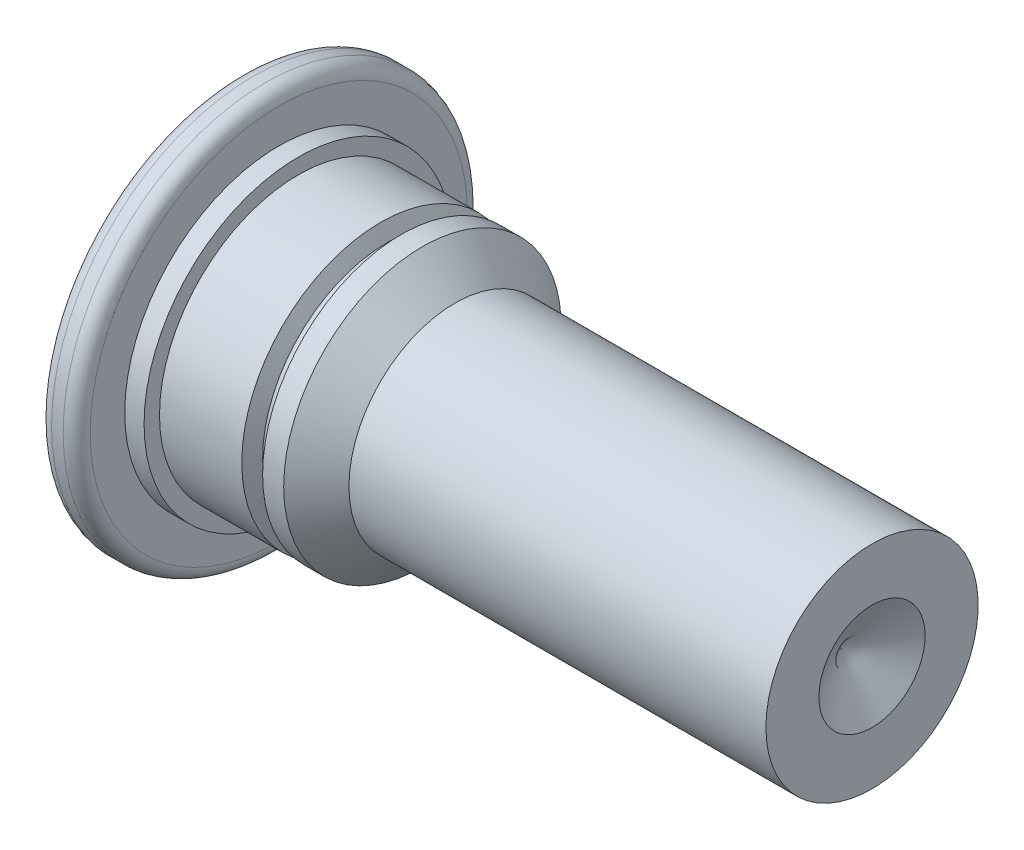
ISO-10303-21;
HEADER;
FILE_DESCRIPTION(('STEP AP214'),'2;1');
FILE_NAME('part.step','',(''),(''),'','','');
FILE_SCHEMA(('AUTOMOTIVE_DESIGN { 1 0 10303 214 1 1 1 1 }'));
ENDSEC;
DATA;
#1=APPLICATION_CONTEXT('core data for automotive mechanical design processes');
#2=APPLICATION_PROTOCOL_DEFINITION('international standard','automotive_design',2000,#1);
#3=PRODUCT_CONTEXT('',#1,'mechanical');
#4=PRODUCT('Part','Part','',(#3));
#5=PRODUCT_RELATED_PRODUCT_CATEGORY('part','',(#4));
#6=PRODUCT_DEFINITION_FORMATION('','',#4);
#7=PRODUCT_DEFINITION_CONTEXT('part definition',#1,'design');
#8=PRODUCT_DEFINITION('design','',#6,#7);
#9=PRODUCT_DEFINITION_SHAPE('','',#8);
#10=(LENGTH_UNIT() NAMED_UNIT(*) SI_UNIT(.MILLI.,.METRE.));
#11=(NAMED_UNIT(*) PLANE_ANGLE_UNIT() SI_UNIT($,.RADIAN.));
#12=(NAMED_UNIT(*) SI_UNIT($,.STERADIAN.) SOLID_ANGLE_UNIT());
#13=UNCERTAINTY_MEASURE_WITH_UNIT(LENGTH_MEASURE(1.E-05),#10,'distance_accuracy_value','');
#14=(GEOMETRIC_REPRESENTATION_CONTEXT(3) GLOBAL_UNCERTAINTY_ASSIGNED_CONTEXT((#13)) GLOBAL_UNIT_ASSIGNED_CONTEXT((#10,
#11,#12)) REPRESENTATION_CONTEXT('',''));
#15=CARTESIAN_POINT('',(0.,0.,0.));
#16=DIRECTION('',(0.,0.,1.));
#17=DIRECTION('',(1.,0.,0.));
#18=AXIS2_PLACEMENT_3D('',#15,#16,#17);
#19=CARTESIAN_POINT('',(0.,0.,0.9479915));
#20=DIRECTION('',(-1.,0.,0.));
#21=DIRECTION('',(0.,0.,1.));
#22=AXIS2_PLACEMENT_3D('',#19,#20,#21);
#23=PLANE('',#22);
#24=CARTESIAN_POINT('',(0.,0.,0.));
#25=DIRECTION('',(1.,0.,0.));
#26=DIRECTION('',(0.,0.,-1.));
#27=AXIS2_PLACEMENT_3D('',#24,#25,#26);
#28=CIRCLE('',#27,1.895983);
#29=CARTESIAN_POINT('',(0.,0.,-1.895983));
#30=VERTEX_POINT('',#29);
#31=CARTESIAN_POINT('',(0.,0.,1.895983));
#32=VERTEX_POINT('',#31);
#33=EDGE_CURVE('E44',#30,#32,#28,.T.);
#34=ORIENTED_EDGE('',*,*,#33,.F.);
#35=CARTESIAN_POINT('',(0.,0.,0.));
#36=DIRECTION('',(1.,0.,0.));
#37=DIRECTION('',(0.,0.,1.));
#38=AXIS2_PLACEMENT_3D('',#35,#36,#37);
#39=CIRCLE('',#38,1.895983);
#40=EDGE_CURVE('E48',#32,#30,#39,.T.);
#41=ORIENTED_EDGE('',*,*,#40,.F.);
#42=EDGE_LOOP('',(#34,#41));
#43=FACE_BOUND('',#42,.T.);
#44=ADVANCED_FACE('F17',(#43),#23,.T.);
#45=CARTESIAN_POINT('',(0.136017,0.,0.));
#46=DIRECTION('',(-1.,0.,0.));
#47=DIRECTION('',(0.,0.,1.));
#48=AXIS2_PLACEMENT_3D('',#45,#46,#47);
#49=TOROIDAL_SURFACE('',#48,1.895983,0.136017);
#50=ORIENTED_EDGE('',*,*,#33,.T.);
#51=ORIENTED_EDGE('',*,*,#40,.T.);
#52=EDGE_LOOP('',(#50,#51));
#53=FACE_BOUND('',#52,.T.);
#54=CARTESIAN_POINT('',(0.136017,0.,0.));
#55=DIRECTION('',(-1.,0.,0.));
#56=DIRECTION('',(0.,0.,1.));
#57=AXIS2_PLACEMENT_3D('',#54,#55,#56);
#58=CIRCLE('',#57,2.032);
#59=CARTESIAN_POINT('',(0.136017,0.,2.032));
#60=VERTEX_POINT('',#59);
#61=EDGE_CURVE('E55',#60,#60,#58,.F.);
#62=ORIENTED_EDGE('',*,*,#61,.F.);
#63=EDGE_LOOP('',(#62));
#64=FACE_BOUND('',#63,.T.);
#65=ADVANCED_FACE('F53',(#53,#64),#49,.T.);
#66=CARTESIAN_POINT('',(0.19431,0.,0.));
#67=DIRECTION('',(-1.,0.,0.));
#68=DIRECTION('',(0.,0.,1.));
#69=AXIS2_PLACEMENT_3D('',#66,#67,#68);
#70=CYLINDRICAL_SURFACE('',#69,2.032);
#71=ORIENTED_EDGE('',*,*,#61,.T.);
#72=EDGE_LOOP('',(#71));
#73=FACE_BOUND('',#72,.T.);
#74=CARTESIAN_POINT('',(0.252603,0.,0.));
#75=DIRECTION('',(-1.,0.,0.));
#76=DIRECTION('',(0.,0.,1.));
#77=AXIS2_PLACEMENT_3D('',#74,#75,#76);
#78=CIRCLE('',#77,2.032);
#79=CARTESIAN_POINT('',(0.252603,0.,2.032));
#80=VERTEX_POINT('',#79);
#81=EDGE_CURVE('E79',#80,#80,#78,.F.);
#82=ORIENTED_EDGE('',*,*,#81,.F.);
#83=EDGE_LOOP('',(#82));
#84=FACE_BOUND('',#83,.T.);
#85=ADVANCED_FACE('F72',(#73,#84),#70,.T.);
#86=CARTESIAN_POINT('',(0.252603,0.,0.));
#87=DIRECTION('',(-1.,0.,0.));
#88=DIRECTION('',(0.,0.,1.));
#89=AXIS2_PLACEMENT_3D('',#86,#87,#88);
#90=TOROIDAL_SURFACE('',#89,1.895983,0.136017);
#91=ORIENTED_EDGE('',*,*,#81,.T.);
#92=EDGE_LOOP('',(#91));
#93=FACE_BOUND('',#92,.T.);
#94=CARTESIAN_POINT('',(0.38862,0.,0.));
#95=DIRECTION('',(-1.,0.,0.));
#96=DIRECTION('',(0.,0.,-1.));
#97=AXIS2_PLACEMENT_3D('',#94,#95,#96);
#98=CIRCLE('',#97,1.895983);
#99=CARTESIAN_POINT('',(0.38862,0.,1.895983));
#100=VERTEX_POINT('',#99);
#101=CARTESIAN_POINT('',(0.38862,0.,-1.895983));
#102=VERTEX_POINT('',#101);
#103=EDGE_CURVE('E115',#100,#102,#98,.F.);
#104=ORIENTED_EDGE('',*,*,#103,.F.);
#105=CARTESIAN_POINT('',(0.38862,0.,0.));
#106=DIRECTION('',(-1.,0.,0.));
#107=DIRECTION('',(0.,0.,1.));
#108=AXIS2_PLACEMENT_3D('',#105,#106,#107);
#109=CIRCLE('',#108,1.895983);
#110=EDGE_CURVE('E82',#102,#100,#109,.F.);
#111=ORIENTED_EDGE('',*,*,#110,.F.);
#112=EDGE_LOOP('',(#104,#111));
#113=FACE_BOUND('',#112,.T.);
#114=ADVANCED_FACE('F87',(#93,#113),#90,.T.);
#115=CARTESIAN_POINT('',(0.38862,0.,1.7226915));
#116=DIRECTION('',(1.,0.,0.));
#117=DIRECTION('',(0.,0.,-1.));
#118=AXIS2_PLACEMENT_3D('',#115,#116,#117);
#119=PLANE('',#118);
#120=CARTESIAN_POINT('',(0.38862,0.,0.));
#121=DIRECTION('',(-1.,0.,0.));
#122=DIRECTION('',(0.,0.,1.));
#123=AXIS2_PLACEMENT_3D('',#120,#121,#122);
#124=CIRCLE('',#123,1.5494);
#125=CARTESIAN_POINT('',(0.38862,0.,1.5494));
#126=VERTEX_POINT('',#125);
#127=EDGE_CURVE('E208',#126,#126,#124,.F.);
#128=ORIENTED_EDGE('',*,*,#127,.F.);
#129=EDGE_LOOP('',(#128));
#130=FACE_BOUND('',#129,.T.);
#131=ORIENTED_EDGE('',*,*,#110,.T.);
#132=ORIENTED_EDGE('',*,*,#103,.T.);
#133=EDGE_LOOP('',(#131,#132));
#134=FACE_BOUND('',#133,.T.);
#135=ADVANCED_FACE('F96',(#130,#134),#119,.T.);
#136=CARTESIAN_POINT('',(0.485775,0.,0.));
#137=DIRECTION('',(-1.,0.,0.));
#138=DIRECTION('',(0.,0.,1.));
#139=AXIS2_PLACEMENT_3D('',#136,#137,#138);
#140=CYLINDRICAL_SURFACE('',#139,1.5494);
#141=ORIENTED_EDGE('',*,*,#127,.T.);
#142=EDGE_LOOP('',(#141));
#143=FACE_BOUND('',#142,.T.);
#144=CARTESIAN_POINT('',(0.58293,0.,0.));
#145=DIRECTION('',(-1.,0.,0.));
#146=DIRECTION('',(0.,0.,1.));
#147=AXIS2_PLACEMENT_3D('',#144,#145,#146);
#148=CIRCLE('',#147,1.5494);
#149=CARTESIAN_POINT('',(0.58293,0.,1.5494));
#150=VERTEX_POINT('',#149);
#151=EDGE_CURVE('E205',#150,#150,#148,.F.);
#152=ORIENTED_EDGE('',*,*,#151,.F.);
#153=EDGE_LOOP('',(#152));
#154=FACE_BOUND('',#153,.T.);
#155=ADVANCED_FACE('F160',(#143,#154),#140,.T.);
#156=CARTESIAN_POINT('',(0.58293,0.,1.47193));
#157=DIRECTION('',(1.,0.,0.));
#158=DIRECTION('',(0.,0.,-1.));
#159=AXIS2_PLACEMENT_3D('',#156,#157,#158);
#160=PLANE('',#159);
#161=CARTESIAN_POINT('',(0.58293,0.,0.));
#162=DIRECTION('',(-1.,0.,0.));
#163=DIRECTION('',(0.,0.,1.));
#164=AXIS2_PLACEMENT_3D('',#161,#162,#163);
#165=CIRCLE('',#164,1.39446);
#166=CARTESIAN_POINT('',(0.58293,0.,1.39446));
#167=VERTEX_POINT('',#166);
#168=EDGE_CURVE('E129',#167,#167,#165,.F.);
#169=ORIENTED_EDGE('',*,*,#168,.F.);
#170=EDGE_LOOP('',(#169));
#171=FACE_BOUND('',#170,.T.);
#172=ORIENTED_EDGE('',*,*,#151,.T.);
#173=EDGE_LOOP('',(#172));
#174=FACE_BOUND('',#173,.T.);
#175=ADVANCED_FACE('F157',(#171,#174),#160,.T.);
#176=CARTESIAN_POINT('',(1.207135,0.,0.));
#177=DIRECTION('',(-1.,0.,0.));
#178=DIRECTION('',(0.,0.,1.));
#179=AXIS2_PLACEMENT_3D('',#176,#177,#178);
#180=CYLINDRICAL_SURFACE('',#179,1.39446);
#181=ORIENTED_EDGE('',*,*,#168,.T.);
#182=EDGE_LOOP('',(#181));
#183=FACE_BOUND('',#182,.T.);
#184=CARTESIAN_POINT('',(1.41008100092677,0.,0.));
#185=DIRECTION('',(-1.,0.,0.));
#186=DIRECTION('',(0.,0.,-1.));
#187=AXIS2_PLACEMENT_3D('',#184,#185,#186);
#188=CIRCLE('',#187,1.39446000048338);
#189=CARTESIAN_POINT('',(1.41008100092677,0.,-1.39446000048338));
#190=VERTEX_POINT('',#189);
#191=EDGE_CURVE('E125',#190,#190,#188,.F.);
#192=ORIENTED_EDGE('',*,*,#191,.F.);
#193=EDGE_LOOP('',(#192));
#194=FACE_BOUND('',#193,.T.);
#195=ADVANCED_FACE('F153',(#183,#194),#180,.T.);
#196=CARTESIAN_POINT('',(1.41008100095519,0.,0.));
#197=DIRECTION('',(-1.,0.,0.));
#198=DIRECTION('',(0.,0.,1.));
#199=AXIS2_PLACEMENT_3D('',#196,#197,#198);
#200=CONICAL_SURFACE('',#199,1.39446000042653,1.10714871779409);
#201=CARTESIAN_POINT('',(1.47980400127,0.,0.));
#202=DIRECTION('',(-1.,0.,0.));
#203=DIRECTION('',(0.,0.,1.));
#204=AXIS2_PLACEMENT_3D('',#201,#202,#203);
#205=CIRCLE('',#204,1.2550140021997);
#206=CARTESIAN_POINT('',(1.47980400127,0.,1.2550140021997));
#207=VERTEX_POINT('',#206);
#208=EDGE_CURVE('E128',#207,#207,#205,.T.);
#209=ORIENTED_EDGE('',*,*,#208,.T.);
#210=EDGE_LOOP('',(#209));
#211=FACE_BOUND('',#210,.T.);
#212=ORIENTED_EDGE('',*,*,#191,.T.);
#213=EDGE_LOOP('',(#212));
#214=FACE_BOUND('',#213,.T.);
#215=ADVANCED_FACE('F148',(#211,#214),#200,.T.);
#216=CARTESIAN_POINT('',(1.5146655,0.,0.));
#217=DIRECTION('',(-1.,0.,0.));
#218=DIRECTION('',(0.,0.,1.));
#219=AXIS2_PLACEMENT_3D('',#216,#217,#218);
#220=TOROIDAL_SURFACE('',#219,1.315395892161,0.0697229999999994);
#221=ORIENTED_EDGE('',*,*,#208,.F.);
#222=EDGE_LOOP('',(#221));
#223=FACE_BOUND('',#222,.T.);
#224=CARTESIAN_POINT('',(1.54952700000877,0.,0.));
#225=DIRECTION('',(1.,0.,0.));
#226=DIRECTION('',(0.,0.,-1.));
#227=AXIS2_PLACEMENT_3D('',#224,#225,#226);
#228=CIRCLE('',#227,1.25501399998029);
#229=CARTESIAN_POINT('',(1.54952700000877,0.,-1.25501399998029));
#230=VERTEX_POINT('',#229);
#231=EDGE_CURVE('E132',#230,#230,#228,.T.);
#232=ORIENTED_EDGE('',*,*,#231,.F.);
#233=EDGE_LOOP('',(#232));
#234=FACE_BOUND('',#233,.T.);
#235=ADVANCED_FACE('F143',(#223,#234),#220,.F.);
#236=CARTESIAN_POINT('',(1.61924999997609,0.,0.));
#237=DIRECTION('',(1.,0.,0.));
#238=DIRECTION('',(0.,1.,0.));
#239=AXIS2_PLACEMENT_3D('',#236,#237,#238);
#240=CONICAL_SURFACE('',#239,1.39445999991494,1.10714871779409);
#241=CARTESIAN_POINT('',(1.61925,0.,0.));
#242=DIRECTION('',(-1.,0.,0.));
#243=DIRECTION('',(0.,0.,1.));
#244=AXIS2_PLACEMENT_3D('',#241,#242,#243);
#245=CIRCLE('',#244,1.39446);
#246=CARTESIAN_POINT('',(1.61925,0.,1.39446));
#247=VERTEX_POINT('',#246);
#248=EDGE_CURVE('E135',#247,#247,#245,.F.);
#249=ORIENTED_EDGE('',*,*,#248,.F.);
#250=EDGE_LOOP('',(#249));
#251=FACE_BOUND('',#250,.T.);
#252=ORIENTED_EDGE('',*,*,#231,.T.);
#253=EDGE_LOOP('',(#252));
#254=FACE_BOUND('',#253,.T.);
#255=ADVANCED_FACE('F147',(#251,#254),#240,.T.);
#256=CARTESIAN_POINT('',(6.34999999999764,0.,0.));
#257=DIRECTION('',(1.,0.,0.));
#258=DIRECTION('',(0.,0.,-1.));
#259=AXIS2_PLACEMENT_3D('',#256,#257,#258);
#260=CONICAL_SURFACE('',#259,0.533400000051643,1.04719755064391);
#261=CARTESIAN_POINT('',(6.04204136635644,0.,8.5265128291212E-11));
#262=VERTEX_POINT('',#261);
#263=VERTEX_LOOP('',#262);
#264=FACE_BOUND('',#263,.T.);
#265=CARTESIAN_POINT('',(6.35000000006327,0.,0.));
#266=DIRECTION('',(1.,0.,0.));
#267=DIRECTION('',(0.,0.,-1.));
#268=AXIS2_PLACEMENT_3D('',#265,#266,#267);
#269=CIRCLE('',#268,0.533400000165329);
#270=CARTESIAN_POINT('',(6.35000000006327,0.,-0.533400000165329));
#271=VERTEX_POINT('',#270);
#272=EDGE_CURVE('E138',#271,#271,#269,.F.);
#273=ORIENTED_EDGE('',*,*,#272,.F.);
#274=EDGE_LOOP('',(#273));
#275=FACE_BOUND('',#274,.T.);
#276=ADVANCED_FACE('F190',(#264,#275),#260,.F.);
#277=CARTESIAN_POINT('',(1.207135,0.,0.));
#278=DIRECTION('',(-1.,0.,0.));
#279=DIRECTION('',(0.,0.,1.));
#280=AXIS2_PLACEMENT_3D('',#277,#278,#279);
#281=CYLINDRICAL_SURFACE('',#280,1.39446);
#282=ORIENTED_EDGE('',*,*,#248,.T.);
#283=EDGE_LOOP('',(#282));
#284=FACE_BOUND('',#283,.T.);
#285=CARTESIAN_POINT('',(1.83133999996699,0.,0.));
#286=DIRECTION('',(-1.,0.,0.));
#287=DIRECTION('',(0.,0.,1.));
#288=AXIS2_PLACEMENT_3D('',#285,#286,#287);
#289=CIRCLE('',#288,1.39446000002863);
#290=CARTESIAN_POINT('',(1.83133999996699,0.,1.39446000002863));
#291=VERTEX_POINT('',#290);
#292=EDGE_CURVE('E141',#291,#291,#289,.F.);
#293=ORIENTED_EDGE('',*,*,#292,.F.);
#294=EDGE_LOOP('',(#293));
#295=FACE_BOUND('',#294,.T.);
#296=ADVANCED_FACE('F187',(#284,#295),#281,.T.);
#297=CARTESIAN_POINT('',(6.35,0.,0.5334));
#298=DIRECTION('',(1.,0.,0.));
#299=DIRECTION('',(0.,0.,-1.));
#300=AXIS2_PLACEMENT_3D('',#297,#298,#299);
#301=PLANE('',#300);
#302=CARTESIAN_POINT('',(6.35,0.,0.));
#303=DIRECTION('',(-1.,0.,0.));
#304=DIRECTION('',(0.,0.,1.));
#305=AXIS2_PLACEMENT_3D('',#302,#303,#304);
#306=CIRCLE('',#305,1.0668);
#307=CARTESIAN_POINT('',(6.35,0.,1.0668));
#308=VERTEX_POINT('',#307);
#309=EDGE_CURVE('E28',#308,#308,#306,.T.);
#310=ORIENTED_EDGE('',*,*,#309,.F.);
#311=EDGE_LOOP('',(#310));
#312=FACE_BOUND('',#311,.T.);
#313=ORIENTED_EDGE('',*,*,#272,.T.);
#314=EDGE_LOOP('',(#313));
#315=FACE_BOUND('',#314,.T.);
#316=ADVANCED_FACE('F179',(#312,#315),#301,.T.);
#317=CARTESIAN_POINT('',(1.83133999991014,0.,0.));
#318=DIRECTION('',(-1.,0.,0.));
#319=DIRECTION('',(0.,0.,1.));
#320=AXIS2_PLACEMENT_3D('',#317,#318,#319);
#321=CONICAL_SURFACE('',#320,1.39446000008547,0.785398163397449);
#322=ORIENTED_EDGE('',*,*,#292,.T.);
#323=EDGE_LOOP('',(#322));
#324=FACE_BOUND('',#323,.T.);
#325=CARTESIAN_POINT('',(2.159,0.,0.));
#326=DIRECTION('',(-1.,0.,0.));
#327=DIRECTION('',(0.,0.,1.));
#328=AXIS2_PLACEMENT_3D('',#325,#326,#327);
#329=CIRCLE('',#328,1.0668);
#330=CARTESIAN_POINT('',(2.159,0.,1.0668));
#331=VERTEX_POINT('',#330);
#332=EDGE_CURVE('E11',#331,#331,#329,.F.);
#333=ORIENTED_EDGE('',*,*,#332,.F.);
#334=EDGE_LOOP('',(#333));
#335=FACE_BOUND('',#334,.T.);
#336=ADVANCED_FACE('F173',(#324,#335),#321,.T.);
#337=CARTESIAN_POINT('',(3.175,0.,0.));
#338=DIRECTION('',(-1.,0.,0.));
#339=DIRECTION('',(0.,0.,1.));
#340=AXIS2_PLACEMENT_3D('',#337,#338,#339);
#341=CYLINDRICAL_SURFACE('',#340,1.0668);
#342=ORIENTED_EDGE('',*,*,#309,.T.);
#343=EDGE_LOOP('',(#342));
#344=FACE_BOUND('',#343,.T.);
#345=ORIENTED_EDGE('',*,*,#332,.T.);
#346=EDGE_LOOP('',(#345));
#347=FACE_BOUND('',#346,.T.);
#348=ADVANCED_FACE('F171',(#344,#347),#341,.T.);
#349=CLOSED_SHELL('',(#44,#65,#85,#114,#135,#155,#175,#195,#215,#235,#255,#276,#296,#316,#336,#348));
#350=MANIFOLD_SOLID_BREP('B1',#349);
#351=ADVANCED_BREP_SHAPE_REPRESENTATION('',(#18,#350),#14);
#352=SHAPE_DEFINITION_REPRESENTATION(#9,#351);
ENDSEC;
END-ISO-10303-21;
